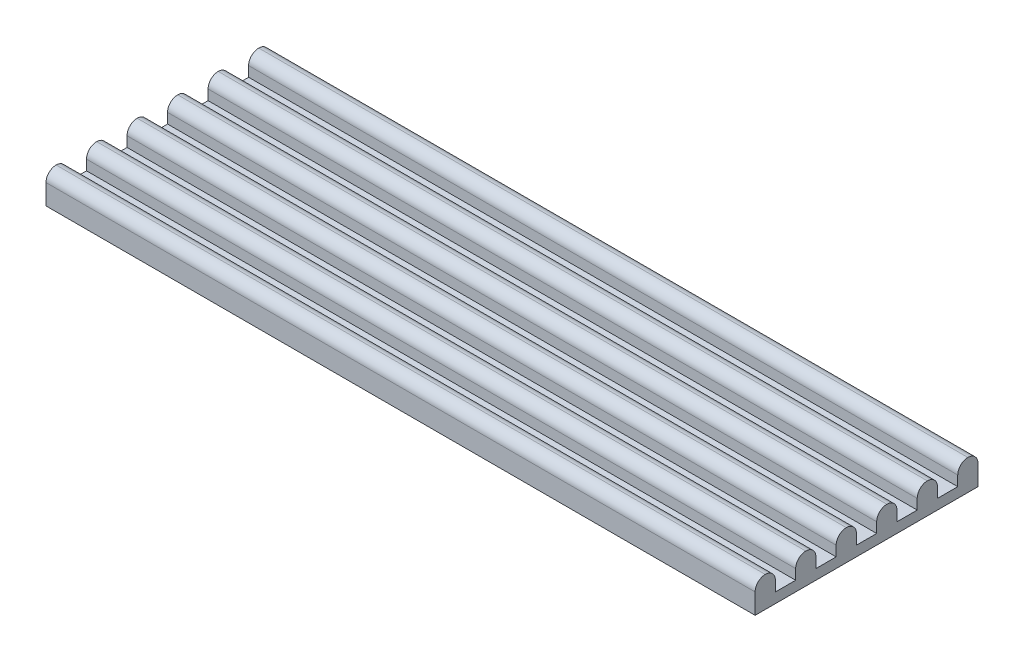
ISO-10303-21;
HEADER;
FILE_DESCRIPTION(('STEP AP214'),'2;1');
FILE_NAME('part.step','',(''),(''),'','','');
FILE_SCHEMA(('AUTOMOTIVE_DESIGN { 1 0 10303 214 1 1 1 1 }'));
ENDSEC;
DATA;
#1=APPLICATION_CONTEXT('core data for automotive mechanical design processes');
#2=APPLICATION_PROTOCOL_DEFINITION('international standard','automotive_design',2000,#1);
#3=PRODUCT_CONTEXT('',#1,'mechanical');
#4=PRODUCT('Part','Part','',(#3));
#5=PRODUCT_RELATED_PRODUCT_CATEGORY('part','',(#4));
#6=PRODUCT_DEFINITION_FORMATION('','',#4);
#7=PRODUCT_DEFINITION_CONTEXT('part definition',#1,'design');
#8=PRODUCT_DEFINITION('design','',#6,#7);
#9=PRODUCT_DEFINITION_SHAPE('','',#8);
#10=(LENGTH_UNIT() NAMED_UNIT(*) SI_UNIT(.MILLI.,.METRE.));
#11=(NAMED_UNIT(*) PLANE_ANGLE_UNIT() SI_UNIT($,.RADIAN.));
#12=(NAMED_UNIT(*) SI_UNIT($,.STERADIAN.) SOLID_ANGLE_UNIT());
#13=UNCERTAINTY_MEASURE_WITH_UNIT(LENGTH_MEASURE(1.E-05),#10,'distance_accuracy_value','');
#14=(GEOMETRIC_REPRESENTATION_CONTEXT(3) GLOBAL_UNCERTAINTY_ASSIGNED_CONTEXT((#13)) GLOBAL_UNIT_ASSIGNED_CONTEXT((#10,
#11,#12)) REPRESENTATION_CONTEXT('',''));
#15=CARTESIAN_POINT('',(0.,0.,0.));
#16=DIRECTION('',(0.,0.,1.));
#17=DIRECTION('',(1.,0.,0.));
#18=AXIS2_PLACEMENT_3D('',#15,#16,#17);
#19=CARTESIAN_POINT('',(35.,3.,-11.));
#20=DIRECTION('',(-1.,0.,0.));
#21=DIRECTION('',(0.,0.,1.));
#22=AXIS2_PLACEMENT_3D('',#19,#20,#21);
#23=PLANE('',#22);
#24=CARTESIAN_POINT('',(35.,2.,10.));
#25=DIRECTION('',(-1.,0.,0.));
#26=DIRECTION('',(0.,0.,1.));
#27=AXIS2_PLACEMENT_3D('',#24,#25,#26);
#28=CIRCLE('',#27,1.);
#29=CARTESIAN_POINT('',(35.,2.,9.));
#30=VERTEX_POINT('',#29);
#31=CARTESIAN_POINT('',(35.,3.,10.));
#32=VERTEX_POINT('',#31);
#33=EDGE_CURVE('E466',#30,#32,#28,.F.);
#34=ORIENTED_EDGE('',*,*,#33,.T.);
#35=CARTESIAN_POINT('',(35.,2.,10.));
#36=DIRECTION('',(-1.,0.,0.));
#37=DIRECTION('',(0.,0.,1.));
#38=AXIS2_PLACEMENT_3D('',#35,#36,#37);
#39=CIRCLE('',#38,1.);
#40=CARTESIAN_POINT('',(35.,2.,11.));
#41=VERTEX_POINT('',#40);
#42=EDGE_CURVE('E469',#32,#41,#39,.F.);
#43=ORIENTED_EDGE('',*,*,#42,.T.);
#44=DIRECTION('',(0.,-1.,0.));
#45=VECTOR('',#44,1.);
#46=CARTESIAN_POINT('',(35.,3.,11.));
#47=LINE('',#46,#45);
#48=CARTESIAN_POINT('',(35.,0.,11.));
#49=VERTEX_POINT('',#48);
#50=EDGE_CURVE('E424',#41,#49,#47,.T.);
#51=ORIENTED_EDGE('',*,*,#50,.T.);
#52=DIRECTION('',(0.,0.,-1.));
#53=VECTOR('',#52,1.);
#54=CARTESIAN_POINT('',(35.,0.,-11.));
#55=LINE('',#54,#53);
#56=CARTESIAN_POINT('',(35.,0.,-11.));
#57=VERTEX_POINT('',#56);
#58=EDGE_CURVE('E278',#49,#57,#55,.T.);
#59=ORIENTED_EDGE('',*,*,#58,.T.);
#60=DIRECTION('',(0.,-1.,0.));
#61=VECTOR('',#60,1.);
#62=CARTESIAN_POINT('',(35.,3.,-11.));
#63=LINE('',#62,#61);
#64=CARTESIAN_POINT('',(35.,2.,-11.));
#65=VERTEX_POINT('',#64);
#66=EDGE_CURVE('E433',#65,#57,#63,.T.);
#67=ORIENTED_EDGE('',*,*,#66,.F.);
#68=CARTESIAN_POINT('',(35.,2.,-9.99999999999999));
#69=DIRECTION('',(-1.,0.,0.));
#70=DIRECTION('',(0.,0.,1.));
#71=AXIS2_PLACEMENT_3D('',#68,#69,#70);
#72=CIRCLE('',#71,1.);
#73=CARTESIAN_POINT('',(35.,3.,-9.99999999999999));
#74=VERTEX_POINT('',#73);
#75=EDGE_CURVE('E436',#65,#74,#72,.F.);
#76=ORIENTED_EDGE('',*,*,#75,.T.);
#77=CARTESIAN_POINT('',(35.,2.,-10.));
#78=DIRECTION('',(-1.,0.,0.));
#79=DIRECTION('',(0.,0.,1.));
#80=AXIS2_PLACEMENT_3D('',#77,#78,#79);
#81=CIRCLE('',#80,1.);
#82=CARTESIAN_POINT('',(35.,2.,-9.));
#83=VERTEX_POINT('',#82);
#84=EDGE_CURVE('E439',#74,#83,#81,.F.);
#85=ORIENTED_EDGE('',*,*,#84,.T.);
#86=DIRECTION('',(0.,1.,0.));
#87=VECTOR('',#86,1.);
#88=CARTESIAN_POINT('',(35.,1.,-9.));
#89=LINE('',#88,#87);
#90=CARTESIAN_POINT('',(35.,1.,-9.));
#91=VERTEX_POINT('',#90);
#92=EDGE_CURVE('E352',#91,#83,#89,.T.);
#93=ORIENTED_EDGE('',*,*,#92,.F.);
#94=DIRECTION('',(0.,0.,-1.));
#95=VECTOR('',#94,1.);
#96=CARTESIAN_POINT('',(35.,1.,0.));
#97=LINE('',#96,#95);
#98=CARTESIAN_POINT('',(35.,1.,-7.));
#99=VERTEX_POINT('',#98);
#100=EDGE_CURVE('E390',#99,#91,#97,.T.);
#101=ORIENTED_EDGE('',*,*,#100,.F.);
#102=DIRECTION('',(0.,1.,0.));
#103=VECTOR('',#102,1.);
#104=CARTESIAN_POINT('',(35.,1.,-7.));
#105=LINE('',#104,#103);
#106=CARTESIAN_POINT('',(35.,2.,-7.));
#107=VERTEX_POINT('',#106);
#108=EDGE_CURVE('E398',#99,#107,#105,.T.);
#109=ORIENTED_EDGE('',*,*,#108,.T.);
#110=CARTESIAN_POINT('',(35.,2.,-6.));
#111=DIRECTION('',(-1.,0.,0.));
#112=DIRECTION('',(0.,0.,1.));
#113=AXIS2_PLACEMENT_3D('',#110,#111,#112);
#114=CIRCLE('',#113,1.);
#115=CARTESIAN_POINT('',(35.,3.,-6.));
#116=VERTEX_POINT('',#115);
#117=EDGE_CURVE('E442',#107,#116,#114,.F.);
#118=ORIENTED_EDGE('',*,*,#117,.T.);
#119=CARTESIAN_POINT('',(35.,2.,-6.));
#120=DIRECTION('',(-1.,0.,0.));
#121=DIRECTION('',(0.,0.,1.));
#122=AXIS2_PLACEMENT_3D('',#119,#120,#121);
#123=CIRCLE('',#122,1.);
#124=CARTESIAN_POINT('',(35.,2.,-5.));
#125=VERTEX_POINT('',#124);
#126=EDGE_CURVE('E445',#116,#125,#123,.F.);
#127=ORIENTED_EDGE('',*,*,#126,.T.);
#128=DIRECTION('',(0.,1.,0.));
#129=VECTOR('',#128,1.);
#130=CARTESIAN_POINT('',(35.,1.,-5.));
#131=LINE('',#130,#129);
#132=CARTESIAN_POINT('',(35.,1.,-5.));
#133=VERTEX_POINT('',#132);
#134=EDGE_CURVE('E371',#133,#125,#131,.T.);
#135=ORIENTED_EDGE('',*,*,#134,.F.);
#136=DIRECTION('',(0.,0.,-1.));
#137=VECTOR('',#136,1.);
#138=CARTESIAN_POINT('',(35.,1.,0.));
#139=LINE('',#138,#137);
#140=CARTESIAN_POINT('',(35.,1.,-3.));
#141=VERTEX_POINT('',#140);
#142=EDGE_CURVE('E351',#141,#133,#139,.T.);
#143=ORIENTED_EDGE('',*,*,#142,.F.);
#144=DIRECTION('',(0.,1.,0.));
#145=VECTOR('',#144,1.);
#146=CARTESIAN_POINT('',(35.,1.,-3.));
#147=LINE('',#146,#145);
#148=CARTESIAN_POINT('',(35.,2.,-3.));
#149=VERTEX_POINT('',#148);
#150=EDGE_CURVE('E363',#141,#149,#147,.T.);
#151=ORIENTED_EDGE('',*,*,#150,.T.);
#152=CARTESIAN_POINT('',(35.,2.,-2.));
#153=DIRECTION('',(-1.,0.,0.));
#154=DIRECTION('',(0.,0.,1.));
#155=AXIS2_PLACEMENT_3D('',#152,#153,#154);
#156=CIRCLE('',#155,1.);
#157=CARTESIAN_POINT('',(35.,3.,-2.));
#158=VERTEX_POINT('',#157);
#159=EDGE_CURVE('E448',#149,#158,#156,.F.);
#160=ORIENTED_EDGE('',*,*,#159,.T.);
#161=CARTESIAN_POINT('',(35.,2.,-2.));
#162=DIRECTION('',(-1.,0.,0.));
#163=DIRECTION('',(0.,0.,1.));
#164=AXIS2_PLACEMENT_3D('',#161,#162,#163);
#165=CIRCLE('',#164,1.);
#166=CARTESIAN_POINT('',(35.,2.,-0.999999999999997));
#167=VERTEX_POINT('',#166);
#168=EDGE_CURVE('E451',#158,#167,#165,.F.);
#169=ORIENTED_EDGE('',*,*,#168,.T.);
#170=DIRECTION('',(0.,1.,0.));
#171=VECTOR('',#170,1.);
#172=CARTESIAN_POINT('',(35.,1.,-0.999999999999997));
#173=LINE('',#172,#171);
#174=CARTESIAN_POINT('',(35.,1.,-0.999999999999997));
#175=VERTEX_POINT('',#174);
#176=EDGE_CURVE('E290',#175,#167,#173,.T.);
#177=ORIENTED_EDGE('',*,*,#176,.F.);
#178=DIRECTION('',(0.,0.,-1.));
#179=VECTOR('',#178,1.);
#180=CARTESIAN_POINT('',(35.,1.,0.));
#181=LINE('',#180,#179);
#182=CARTESIAN_POINT('',(35.,1.,1.));
#183=VERTEX_POINT('',#182);
#184=EDGE_CURVE('E328',#183,#175,#181,.T.);
#185=ORIENTED_EDGE('',*,*,#184,.F.);
#186=DIRECTION('',(0.,1.,0.));
#187=VECTOR('',#186,1.);
#188=CARTESIAN_POINT('',(35.,1.,1.));
#189=LINE('',#188,#187);
#190=CARTESIAN_POINT('',(35.,2.,1.));
#191=VERTEX_POINT('',#190);
#192=EDGE_CURVE('E336',#183,#191,#189,.T.);
#193=ORIENTED_EDGE('',*,*,#192,.T.);
#194=CARTESIAN_POINT('',(35.,2.,2.));
#195=DIRECTION('',(-1.,0.,0.));
#196=DIRECTION('',(0.,0.,1.));
#197=AXIS2_PLACEMENT_3D('',#194,#195,#196);
#198=CIRCLE('',#197,1.);
#199=CARTESIAN_POINT('',(35.,3.,2.));
#200=VERTEX_POINT('',#199);
#201=EDGE_CURVE('E454',#191,#200,#198,.F.);
#202=ORIENTED_EDGE('',*,*,#201,.T.);
#203=CARTESIAN_POINT('',(35.,2.,2.));
#204=DIRECTION('',(-1.,0.,0.));
#205=DIRECTION('',(0.,0.,1.));
#206=AXIS2_PLACEMENT_3D('',#203,#204,#205);
#207=CIRCLE('',#206,1.);
#208=CARTESIAN_POINT('',(35.,2.,3.));
#209=VERTEX_POINT('',#208);
#210=EDGE_CURVE('E457',#200,#209,#207,.F.);
#211=ORIENTED_EDGE('',*,*,#210,.T.);
#212=DIRECTION('',(0.,1.,0.));
#213=VECTOR('',#212,1.);
#214=CARTESIAN_POINT('',(35.,1.,3.));
#215=LINE('',#214,#213);
#216=CARTESIAN_POINT('',(35.,1.,3.));
#217=VERTEX_POINT('',#216);
#218=EDGE_CURVE('E309',#217,#209,#215,.T.);
#219=ORIENTED_EDGE('',*,*,#218,.F.);
#220=DIRECTION('',(0.,0.,-1.));
#221=VECTOR('',#220,1.);
#222=CARTESIAN_POINT('',(35.,1.,0.));
#223=LINE('',#222,#221);
#224=CARTESIAN_POINT('',(35.,1.,5.));
#225=VERTEX_POINT('',#224);
#226=EDGE_CURVE('E289',#225,#217,#223,.T.);
#227=ORIENTED_EDGE('',*,*,#226,.F.);
#228=DIRECTION('',(0.,1.,0.));
#229=VECTOR('',#228,1.);
#230=CARTESIAN_POINT('',(35.,1.,5.));
#231=LINE('',#230,#229);
#232=CARTESIAN_POINT('',(35.,2.,5.));
#233=VERTEX_POINT('',#232);
#234=EDGE_CURVE('E301',#225,#233,#231,.T.);
#235=ORIENTED_EDGE('',*,*,#234,.T.);
#236=CARTESIAN_POINT('',(35.,2.,6.));
#237=DIRECTION('',(-1.,0.,0.));
#238=DIRECTION('',(0.,0.,1.));
#239=AXIS2_PLACEMENT_3D('',#236,#237,#238);
#240=CIRCLE('',#239,1.);
#241=CARTESIAN_POINT('',(35.,3.,6.));
#242=VERTEX_POINT('',#241);
#243=EDGE_CURVE('E460',#233,#242,#240,.F.);
#244=ORIENTED_EDGE('',*,*,#243,.T.);
#245=CARTESIAN_POINT('',(35.,2.,6.));
#246=DIRECTION('',(-1.,0.,0.));
#247=DIRECTION('',(0.,0.,1.));
#248=AXIS2_PLACEMENT_3D('',#245,#246,#247);
#249=CIRCLE('',#248,1.);
#250=CARTESIAN_POINT('',(35.,2.,7.));
#251=VERTEX_POINT('',#250);
#252=EDGE_CURVE('E463',#242,#251,#249,.F.);
#253=ORIENTED_EDGE('',*,*,#252,.T.);
#254=DIRECTION('',(0.,1.,0.));
#255=VECTOR('',#254,1.);
#256=CARTESIAN_POINT('',(35.,1.,7.));
#257=LINE('',#256,#255);
#258=CARTESIAN_POINT('',(35.,1.,7.));
#259=VERTEX_POINT('',#258);
#260=EDGE_CURVE('E275',#259,#251,#257,.T.);
#261=ORIENTED_EDGE('',*,*,#260,.F.);
#262=DIRECTION('',(0.,0.,-1.));
#263=VECTOR('',#262,1.);
#264=CARTESIAN_POINT('',(35.,1.,0.));
#265=LINE('',#264,#263);
#266=CARTESIAN_POINT('',(35.,1.,9.));
#267=VERTEX_POINT('',#266);
#268=EDGE_CURVE('E254',#267,#259,#265,.T.);
#269=ORIENTED_EDGE('',*,*,#268,.F.);
#270=DIRECTION('',(0.,1.,0.));
#271=VECTOR('',#270,1.);
#272=CARTESIAN_POINT('',(35.,1.,9.));
#273=LINE('',#272,#271);
#274=EDGE_CURVE('E279',#267,#30,#273,.T.);
#275=ORIENTED_EDGE('',*,*,#274,.T.);
#276=EDGE_LOOP('',(#34,#43,#51,#59,#67,#76,#85,#93,#101,#109,#118,#127,#135,#143,#151,#160,#169,
#177,#185,#193,#202,#211,#219,#227,#235,#244,#253,#261,#269,#275));
#277=FACE_BOUND('',#276,.T.);
#278=ADVANCED_FACE('F45',(#277),#23,.F.);
#279=CARTESIAN_POINT('',(-35.,3.,-11.));
#280=DIRECTION('',(1.,0.,0.));
#281=DIRECTION('',(0.,0.,-1.));
#282=AXIS2_PLACEMENT_3D('',#279,#280,#281);
#283=PLANE('',#282);
#284=DIRECTION('',(0.,-1.,0.));
#285=VECTOR('',#284,1.);
#286=CARTESIAN_POINT('',(-35.,3.,11.));
#287=LINE('',#286,#285);
#288=CARTESIAN_POINT('',(-35.,2.,11.));
#289=VERTEX_POINT('',#288);
#290=CARTESIAN_POINT('',(-35.,0.,11.));
#291=VERTEX_POINT('',#290);
#292=EDGE_CURVE('E427',#289,#291,#287,.T.);
#293=ORIENTED_EDGE('',*,*,#292,.F.);
#294=CARTESIAN_POINT('',(-35.,2.,10.));
#295=DIRECTION('',(1.,0.,0.));
#296=DIRECTION('',(0.,0.,-1.));
#297=AXIS2_PLACEMENT_3D('',#294,#295,#296);
#298=CIRCLE('',#297,1.);
#299=CARTESIAN_POINT('',(-35.,3.,10.));
#300=VERTEX_POINT('',#299);
#301=EDGE_CURVE('E68',#289,#300,#298,.F.);
#302=ORIENTED_EDGE('',*,*,#301,.T.);
#303=CARTESIAN_POINT('',(-35.,2.,10.));
#304=DIRECTION('',(1.,0.,0.));
#305=DIRECTION('',(0.,0.,-1.));
#306=AXIS2_PLACEMENT_3D('',#303,#304,#305);
#307=CIRCLE('',#306,1.);
#308=CARTESIAN_POINT('',(-35.,2.,9.));
#309=VERTEX_POINT('',#308);
#310=EDGE_CURVE('E63',#300,#309,#307,.F.);
#311=ORIENTED_EDGE('',*,*,#310,.T.);
#312=DIRECTION('',(0.,1.,0.));
#313=VECTOR('',#312,1.);
#314=CARTESIAN_POINT('',(-35.,1.,9.));
#315=LINE('',#314,#313);
#316=CARTESIAN_POINT('',(-35.,1.,9.));
#317=VERTEX_POINT('',#316);
#318=EDGE_CURVE('E253',#317,#309,#315,.T.);
#319=ORIENTED_EDGE('',*,*,#318,.F.);
#320=DIRECTION('',(0.,0.,1.));
#321=VECTOR('',#320,1.);
#322=CARTESIAN_POINT('',(-35.,1.,0.));
#323=LINE('',#322,#321);
#324=CARTESIAN_POINT('',(-35.,1.,7.));
#325=VERTEX_POINT('',#324);
#326=EDGE_CURVE('E260',#325,#317,#323,.T.);
#327=ORIENTED_EDGE('',*,*,#326,.F.);
#328=DIRECTION('',(0.,1.,0.));
#329=VECTOR('',#328,1.);
#330=CARTESIAN_POINT('',(-35.,1.,7.));
#331=LINE('',#330,#329);
#332=CARTESIAN_POINT('',(-35.,2.,7.));
#333=VERTEX_POINT('',#332);
#334=EDGE_CURVE('E243',#325,#333,#331,.T.);
#335=ORIENTED_EDGE('',*,*,#334,.T.);
#336=CARTESIAN_POINT('',(-35.,2.,6.));
#337=DIRECTION('',(1.,0.,0.));
#338=DIRECTION('',(0.,0.,-1.));
#339=AXIS2_PLACEMENT_3D('',#336,#337,#338);
#340=CIRCLE('',#339,1.);
#341=CARTESIAN_POINT('',(-35.,3.,6.));
#342=VERTEX_POINT('',#341);
#343=EDGE_CURVE('E503',#333,#342,#340,.F.);
#344=ORIENTED_EDGE('',*,*,#343,.T.);
#345=CARTESIAN_POINT('',(-35.,2.,6.));
#346=DIRECTION('',(1.,0.,0.));
#347=DIRECTION('',(0.,0.,-1.));
#348=AXIS2_PLACEMENT_3D('',#345,#346,#347);
#349=CIRCLE('',#348,1.);
#350=CARTESIAN_POINT('',(-35.,2.,5.));
#351=VERTEX_POINT('',#350);
#352=EDGE_CURVE('E500',#342,#351,#349,.F.);
#353=ORIENTED_EDGE('',*,*,#352,.T.);
#354=DIRECTION('',(0.,1.,0.));
#355=VECTOR('',#354,1.);
#356=CARTESIAN_POINT('',(-35.,1.,5.));
#357=LINE('',#356,#355);
#358=CARTESIAN_POINT('',(-35.,1.,5.));
#359=VERTEX_POINT('',#358);
#360=EDGE_CURVE('E264',#359,#351,#357,.T.);
#361=ORIENTED_EDGE('',*,*,#360,.F.);
#362=DIRECTION('',(0.,0.,1.));
#363=VECTOR('',#362,1.);
#364=CARTESIAN_POINT('',(-35.,1.,0.));
#365=LINE('',#364,#363);
#366=CARTESIAN_POINT('',(-35.,1.,3.));
#367=VERTEX_POINT('',#366);
#368=EDGE_CURVE('E297',#367,#359,#365,.T.);
#369=ORIENTED_EDGE('',*,*,#368,.F.);
#370=DIRECTION('',(0.,1.,0.));
#371=VECTOR('',#370,1.);
#372=CARTESIAN_POINT('',(-35.,1.,3.));
#373=LINE('',#372,#371);
#374=CARTESIAN_POINT('',(-35.,2.,3.));
#375=VERTEX_POINT('',#374);
#376=EDGE_CURVE('E305',#367,#375,#373,.T.);
#377=ORIENTED_EDGE('',*,*,#376,.T.);
#378=CARTESIAN_POINT('',(-35.,2.,2.));
#379=DIRECTION('',(1.,0.,0.));
#380=DIRECTION('',(0.,0.,-1.));
#381=AXIS2_PLACEMENT_3D('',#378,#379,#380);
#382=CIRCLE('',#381,1.);
#383=CARTESIAN_POINT('',(-35.,3.,2.));
#384=VERTEX_POINT('',#383);
#385=EDGE_CURVE('E497',#375,#384,#382,.F.);
#386=ORIENTED_EDGE('',*,*,#385,.T.);
#387=CARTESIAN_POINT('',(-35.,2.,2.));
#388=DIRECTION('',(1.,0.,0.));
#389=DIRECTION('',(0.,0.,-1.));
#390=AXIS2_PLACEMENT_3D('',#387,#388,#389);
#391=CIRCLE('',#390,1.);
#392=CARTESIAN_POINT('',(-35.,2.,1.));
#393=VERTEX_POINT('',#392);
#394=EDGE_CURVE('E494',#384,#393,#391,.F.);
#395=ORIENTED_EDGE('',*,*,#394,.T.);
#396=DIRECTION('',(0.,1.,0.));
#397=VECTOR('',#396,1.);
#398=CARTESIAN_POINT('',(-35.,1.,1.));
#399=LINE('',#398,#397);
#400=CARTESIAN_POINT('',(-35.,1.,1.));
#401=VERTEX_POINT('',#400);
#402=EDGE_CURVE('E340',#401,#393,#399,.T.);
#403=ORIENTED_EDGE('',*,*,#402,.F.);
#404=DIRECTION('',(0.,0.,1.));
#405=VECTOR('',#404,1.);
#406=CARTESIAN_POINT('',(-35.,1.,0.));
#407=LINE('',#406,#405);
#408=CARTESIAN_POINT('',(-35.,1.,-0.999999999999997));
#409=VERTEX_POINT('',#408);
#410=EDGE_CURVE('E319',#409,#401,#407,.T.);
#411=ORIENTED_EDGE('',*,*,#410,.F.);
#412=DIRECTION('',(0.,1.,0.));
#413=VECTOR('',#412,1.);
#414=CARTESIAN_POINT('',(-35.,1.,-0.999999999999997));
#415=LINE('',#414,#413);
#416=CARTESIAN_POINT('',(-35.,2.,-0.999999999999997));
#417=VERTEX_POINT('',#416);
#418=EDGE_CURVE('E332',#409,#417,#415,.T.);
#419=ORIENTED_EDGE('',*,*,#418,.T.);
#420=CARTESIAN_POINT('',(-35.,2.,-2.));
#421=DIRECTION('',(1.,0.,0.));
#422=DIRECTION('',(0.,0.,-1.));
#423=AXIS2_PLACEMENT_3D('',#420,#421,#422);
#424=CIRCLE('',#423,1.);
#425=CARTESIAN_POINT('',(-35.,3.,-2.));
#426=VERTEX_POINT('',#425);
#427=EDGE_CURVE('E491',#417,#426,#424,.F.);
#428=ORIENTED_EDGE('',*,*,#427,.T.);
#429=CARTESIAN_POINT('',(-35.,2.,-2.));
#430=DIRECTION('',(1.,0.,0.));
#431=DIRECTION('',(0.,0.,-1.));
#432=AXIS2_PLACEMENT_3D('',#429,#430,#431);
#433=CIRCLE('',#432,1.);
#434=CARTESIAN_POINT('',(-35.,2.,-3.));
#435=VERTEX_POINT('',#434);
#436=EDGE_CURVE('E488',#426,#435,#433,.F.);
#437=ORIENTED_EDGE('',*,*,#436,.T.);
#438=DIRECTION('',(0.,1.,0.));
#439=VECTOR('',#438,1.);
#440=CARTESIAN_POINT('',(-35.,1.,-3.));
#441=LINE('',#440,#439);
#442=CARTESIAN_POINT('',(-35.,1.,-3.));
#443=VERTEX_POINT('',#442);
#444=EDGE_CURVE('E320',#443,#435,#441,.T.);
#445=ORIENTED_EDGE('',*,*,#444,.F.);
#446=DIRECTION('',(0.,0.,1.));
#447=VECTOR('',#446,1.);
#448=CARTESIAN_POINT('',(-35.,1.,0.));
#449=LINE('',#448,#447);
#450=CARTESIAN_POINT('',(-35.,1.,-5.));
#451=VERTEX_POINT('',#450);
#452=EDGE_CURVE('E359',#451,#443,#449,.T.);
#453=ORIENTED_EDGE('',*,*,#452,.F.);
#454=DIRECTION('',(0.,1.,0.));
#455=VECTOR('',#454,1.);
#456=CARTESIAN_POINT('',(-35.,1.,-5.));
#457=LINE('',#456,#455);
#458=CARTESIAN_POINT('',(-35.,2.,-5.));
#459=VERTEX_POINT('',#458);
#460=EDGE_CURVE('E367',#451,#459,#457,.T.);
#461=ORIENTED_EDGE('',*,*,#460,.T.);
#462=CARTESIAN_POINT('',(-35.,2.,-6.));
#463=DIRECTION('',(1.,0.,0.));
#464=DIRECTION('',(0.,0.,-1.));
#465=AXIS2_PLACEMENT_3D('',#462,#463,#464);
#466=CIRCLE('',#465,1.);
#467=CARTESIAN_POINT('',(-35.,3.,-6.));
#468=VERTEX_POINT('',#467);
#469=EDGE_CURVE('E485',#459,#468,#466,.F.);
#470=ORIENTED_EDGE('',*,*,#469,.T.);
#471=CARTESIAN_POINT('',(-35.,2.,-6.));
#472=DIRECTION('',(1.,0.,0.));
#473=DIRECTION('',(0.,0.,-1.));
#474=AXIS2_PLACEMENT_3D('',#471,#472,#473);
#475=CIRCLE('',#474,1.);
#476=CARTESIAN_POINT('',(-35.,2.,-7.));
#477=VERTEX_POINT('',#476);
#478=EDGE_CURVE('E482',#468,#477,#475,.F.);
#479=ORIENTED_EDGE('',*,*,#478,.T.);
#480=DIRECTION('',(0.,1.,0.));
#481=VECTOR('',#480,1.);
#482=CARTESIAN_POINT('',(-35.,1.,-7.));
#483=LINE('',#482,#481);
#484=CARTESIAN_POINT('',(-35.,1.,-7.));
#485=VERTEX_POINT('',#484);
#486=EDGE_CURVE('E402',#485,#477,#483,.T.);
#487=ORIENTED_EDGE('',*,*,#486,.F.);
#488=DIRECTION('',(0.,0.,1.));
#489=VECTOR('',#488,1.);
#490=CARTESIAN_POINT('',(-35.,1.,0.));
#491=LINE('',#490,#489);
#492=CARTESIAN_POINT('',(-35.,1.,-9.));
#493=VERTEX_POINT('',#492);
#494=EDGE_CURVE('E381',#493,#485,#491,.T.);
#495=ORIENTED_EDGE('',*,*,#494,.F.);
#496=DIRECTION('',(0.,1.,0.));
#497=VECTOR('',#496,1.);
#498=CARTESIAN_POINT('',(-35.,1.,-9.));
#499=LINE('',#498,#497);
#500=CARTESIAN_POINT('',(-35.,2.,-9.));
#501=VERTEX_POINT('',#500);
#502=EDGE_CURVE('E394',#493,#501,#499,.T.);
#503=ORIENTED_EDGE('',*,*,#502,.T.);
#504=CARTESIAN_POINT('',(-35.,2.,-10.));
#505=DIRECTION('',(1.,0.,0.));
#506=DIRECTION('',(0.,0.,-1.));
#507=AXIS2_PLACEMENT_3D('',#504,#505,#506);
#508=CIRCLE('',#507,1.);
#509=CARTESIAN_POINT('',(-35.,3.,-9.99999999999999));
#510=VERTEX_POINT('',#509);
#511=EDGE_CURVE('E479',#501,#510,#508,.F.);
#512=ORIENTED_EDGE('',*,*,#511,.T.);
#513=CARTESIAN_POINT('',(-35.,2.,-9.99999999999999));
#514=DIRECTION('',(1.,0.,0.));
#515=DIRECTION('',(0.,0.,-1.));
#516=AXIS2_PLACEMENT_3D('',#513,#514,#515);
#517=CIRCLE('',#516,1.);
#518=CARTESIAN_POINT('',(-35.,2.,-11.));
#519=VERTEX_POINT('',#518);
#520=EDGE_CURVE('E476',#510,#519,#517,.F.);
#521=ORIENTED_EDGE('',*,*,#520,.T.);
#522=DIRECTION('',(0.,-1.,0.));
#523=VECTOR('',#522,1.);
#524=CARTESIAN_POINT('',(-35.,3.,-11.));
#525=LINE('',#524,#523);
#526=CARTESIAN_POINT('',(-35.,0.,-11.));
#527=VERTEX_POINT('',#526);
#528=EDGE_CURVE('E430',#519,#527,#525,.T.);
#529=ORIENTED_EDGE('',*,*,#528,.T.);
#530=DIRECTION('',(0.,0.,1.));
#531=VECTOR('',#530,1.);
#532=CARTESIAN_POINT('',(-35.,0.,-11.));
#533=LINE('',#532,#531);
#534=EDGE_CURVE('E416',#527,#291,#533,.T.);
#535=ORIENTED_EDGE('',*,*,#534,.T.);
#536=EDGE_LOOP('',(#293,#302,#311,#319,#327,#335,#344,#353,#361,#369,#377,#386,#395,#403,#411,
#419,#428,#437,#445,#453,#461,#470,#479,#487,#495,#503,#512,#521,#529,#535));
#537=FACE_BOUND('',#536,.T.);
#538=ADVANCED_FACE('F266',(#537),#283,.F.);
#539=CARTESIAN_POINT('',(-35.,3.,-11.));
#540=DIRECTION('',(0.,0.,1.));
#541=DIRECTION('',(1.,0.,0.));
#542=AXIS2_PLACEMENT_3D('',#539,#540,#541);
#543=PLANE('',#542);
#544=ORIENTED_EDGE('',*,*,#528,.F.);
#545=DIRECTION('',(-1.,0.,0.));
#546=VECTOR('',#545,1.);
#547=CARTESIAN_POINT('',(35.,2.,-11.));
#548=LINE('',#547,#546);
#549=EDGE_CURVE('E11',#519,#65,#548,.F.);
#550=ORIENTED_EDGE('',*,*,#549,.T.);
#551=ORIENTED_EDGE('',*,*,#66,.T.);
#552=DIRECTION('',(-1.,0.,0.));
#553=VECTOR('',#552,1.);
#554=CARTESIAN_POINT('',(-35.,0.,-11.));
#555=LINE('',#554,#553);
#556=EDGE_CURVE('E412',#57,#527,#555,.T.);
#557=ORIENTED_EDGE('',*,*,#556,.T.);
#558=EDGE_LOOP('',(#544,#550,#551,#557));
#559=FACE_BOUND('',#558,.T.);
#560=ADVANCED_FACE('F575',(#559),#543,.F.);
#561=CARTESIAN_POINT('',(-35.,3.,11.));
#562=DIRECTION('',(0.,0.,-1.));
#563=DIRECTION('',(-1.,0.,0.));
#564=AXIS2_PLACEMENT_3D('',#561,#562,#563);
#565=PLANE('',#564);
#566=ORIENTED_EDGE('',*,*,#50,.F.);
#567=DIRECTION('',(1.,0.,0.));
#568=VECTOR('',#567,1.);
#569=CARTESIAN_POINT('',(-35.,2.,11.));
#570=LINE('',#569,#568);
#571=EDGE_CURVE('E472',#41,#289,#570,.F.);
#572=ORIENTED_EDGE('',*,*,#571,.T.);
#573=ORIENTED_EDGE('',*,*,#292,.T.);
#574=DIRECTION('',(1.,0.,0.));
#575=VECTOR('',#574,1.);
#576=CARTESIAN_POINT('',(-35.,0.,11.));
#577=LINE('',#576,#575);
#578=EDGE_CURVE('E420',#291,#49,#577,.T.);
#579=ORIENTED_EDGE('',*,*,#578,.T.);
#580=EDGE_LOOP('',(#566,#572,#573,#579));
#581=FACE_BOUND('',#580,.T.);
#582=ADVANCED_FACE('F585',(#581),#565,.F.);
#583=CARTESIAN_POINT('',(0.,0.,0.));
#584=DIRECTION('',(0.,1.,0.));
#585=DIRECTION('',(0.,0.,1.));
#586=AXIS2_PLACEMENT_3D('',#583,#584,#585);
#587=PLANE('',#586);
#588=ORIENTED_EDGE('',*,*,#58,.F.);
#589=ORIENTED_EDGE('',*,*,#578,.F.);
#590=ORIENTED_EDGE('',*,*,#534,.F.);
#591=ORIENTED_EDGE('',*,*,#556,.F.);
#592=EDGE_LOOP('',(#588,#589,#590,#591));
#593=FACE_BOUND('',#592,.T.);
#594=ADVANCED_FACE('F582',(#593),#587,.F.);
#595=CARTESIAN_POINT('',(0.,1.,-9.));
#596=DIRECTION('',(0.,0.,1.));
#597=DIRECTION('',(1.,0.,0.));
#598=AXIS2_PLACEMENT_3D('',#595,#596,#597);
#599=PLANE('',#598);
#600=ORIENTED_EDGE('',*,*,#92,.T.);
#601=DIRECTION('',(1.,0.,0.));
#602=VECTOR('',#601,1.);
#603=CARTESIAN_POINT('',(0.,2.,-9.));
#604=LINE('',#603,#602);
#605=EDGE_CURVE('E55',#83,#501,#604,.F.);
#606=ORIENTED_EDGE('',*,*,#605,.T.);
#607=ORIENTED_EDGE('',*,*,#502,.F.);
#608=DIRECTION('',(1.,0.,0.));
#609=VECTOR('',#608,1.);
#610=CARTESIAN_POINT('',(0.,1.,-9.));
#611=LINE('',#610,#609);
#612=EDGE_CURVE('E378',#493,#91,#611,.T.);
#613=ORIENTED_EDGE('',*,*,#612,.T.);
#614=EDGE_LOOP('',(#600,#606,#607,#613));
#615=FACE_BOUND('',#614,.T.);
#616=ADVANCED_FACE('F676',(#615),#599,.T.);
#617=CARTESIAN_POINT('',(0.,1.,-7.));
#618=DIRECTION('',(0.,0.,1.));
#619=DIRECTION('',(1.,0.,0.));
#620=AXIS2_PLACEMENT_3D('',#617,#618,#619);
#621=PLANE('',#620);
#622=ORIENTED_EDGE('',*,*,#486,.T.);
#623=DIRECTION('',(1.,0.,0.));
#624=VECTOR('',#623,1.);
#625=CARTESIAN_POINT('',(35.,2.,-7.));
#626=LINE('',#625,#624);
#627=EDGE_CURVE('E536',#477,#107,#626,.T.);
#628=ORIENTED_EDGE('',*,*,#627,.T.);
#629=ORIENTED_EDGE('',*,*,#108,.F.);
#630=DIRECTION('',(1.,0.,0.));
#631=VECTOR('',#630,1.);
#632=CARTESIAN_POINT('',(0.,1.,-7.));
#633=LINE('',#632,#631);
#634=EDGE_CURVE('E386',#485,#99,#633,.T.);
#635=ORIENTED_EDGE('',*,*,#634,.F.);
#636=EDGE_LOOP('',(#622,#628,#629,#635));
#637=FACE_BOUND('',#636,.T.);
#638=ADVANCED_FACE('F671',(#637),#621,.F.);
#639=CARTESIAN_POINT('',(0.,1.,0.));
#640=DIRECTION('',(0.,1.,0.));
#641=DIRECTION('',(0.,0.,1.));
#642=AXIS2_PLACEMENT_3D('',#639,#640,#641);
#643=PLANE('',#642);
#644=ORIENTED_EDGE('',*,*,#612,.F.);
#645=ORIENTED_EDGE('',*,*,#494,.T.);
#646=ORIENTED_EDGE('',*,*,#634,.T.);
#647=ORIENTED_EDGE('',*,*,#100,.T.);
#648=EDGE_LOOP('',(#644,#645,#646,#647));
#649=FACE_BOUND('',#648,.T.);
#650=ADVANCED_FACE('F674',(#649),#643,.T.);
#651=CARTESIAN_POINT('',(0.,1.,-3.));
#652=DIRECTION('',(0.,0.,1.));
#653=DIRECTION('',(1.,0.,0.));
#654=AXIS2_PLACEMENT_3D('',#651,#652,#653);
#655=PLANE('',#654);
#656=ORIENTED_EDGE('',*,*,#444,.T.);
#657=DIRECTION('',(1.,0.,0.));
#658=VECTOR('',#657,1.);
#659=CARTESIAN_POINT('',(35.,2.,-3.));
#660=LINE('',#659,#658);
#661=EDGE_CURVE('E529',#435,#149,#660,.T.);
#662=ORIENTED_EDGE('',*,*,#661,.T.);
#663=ORIENTED_EDGE('',*,*,#150,.F.);
#664=DIRECTION('',(1.,0.,0.));
#665=VECTOR('',#664,1.);
#666=CARTESIAN_POINT('',(0.,1.,-3.));
#667=LINE('',#666,#665);
#668=EDGE_CURVE('E347',#443,#141,#667,.T.);
#669=ORIENTED_EDGE('',*,*,#668,.F.);
#670=EDGE_LOOP('',(#656,#662,#663,#669));
#671=FACE_BOUND('',#670,.T.);
#672=ADVANCED_FACE('F652',(#671),#655,.F.);
#673=CARTESIAN_POINT('',(0.,1.,-5.));
#674=DIRECTION('',(0.,0.,1.));
#675=DIRECTION('',(1.,0.,0.));
#676=AXIS2_PLACEMENT_3D('',#673,#674,#675);
#677=PLANE('',#676);
#678=ORIENTED_EDGE('',*,*,#134,.T.);
#679=DIRECTION('',(1.,0.,0.));
#680=VECTOR('',#679,1.);
#681=CARTESIAN_POINT('',(0.,2.,-5.));
#682=LINE('',#681,#680);
#683=EDGE_CURVE('E532',#125,#459,#682,.F.);
#684=ORIENTED_EDGE('',*,*,#683,.T.);
#685=ORIENTED_EDGE('',*,*,#460,.F.);
#686=DIRECTION('',(1.,0.,0.));
#687=VECTOR('',#686,1.);
#688=CARTESIAN_POINT('',(0.,1.,-5.));
#689=LINE('',#688,#687);
#690=EDGE_CURVE('E356',#451,#133,#689,.T.);
#691=ORIENTED_EDGE('',*,*,#690,.T.);
#692=EDGE_LOOP('',(#678,#684,#685,#691));
#693=FACE_BOUND('',#692,.T.);
#694=ADVANCED_FACE('F659',(#693),#677,.T.);
#695=CARTESIAN_POINT('',(0.,1.,0.));
#696=DIRECTION('',(0.,1.,0.));
#697=DIRECTION('',(0.,0.,1.));
#698=AXIS2_PLACEMENT_3D('',#695,#696,#697);
#699=PLANE('',#698);
#700=ORIENTED_EDGE('',*,*,#668,.T.);
#701=ORIENTED_EDGE('',*,*,#142,.T.);
#702=ORIENTED_EDGE('',*,*,#690,.F.);
#703=ORIENTED_EDGE('',*,*,#452,.T.);
#704=EDGE_LOOP('',(#700,#701,#702,#703));
#705=FACE_BOUND('',#704,.T.);
#706=ADVANCED_FACE('F656',(#705),#699,.T.);
#707=CARTESIAN_POINT('',(0.,1.,-0.999999999999997));
#708=DIRECTION('',(0.,0.,1.));
#709=DIRECTION('',(1.,0.,0.));
#710=AXIS2_PLACEMENT_3D('',#707,#708,#709);
#711=PLANE('',#710);
#712=ORIENTED_EDGE('',*,*,#176,.T.);
#713=DIRECTION('',(1.,0.,0.));
#714=VECTOR('',#713,1.);
#715=CARTESIAN_POINT('',(0.,2.,-0.999999999999997));
#716=LINE('',#715,#714);
#717=EDGE_CURVE('E525',#167,#417,#716,.F.);
#718=ORIENTED_EDGE('',*,*,#717,.T.);
#719=ORIENTED_EDGE('',*,*,#418,.F.);
#720=DIRECTION('',(1.,0.,0.));
#721=VECTOR('',#720,1.);
#722=CARTESIAN_POINT('',(0.,1.,-0.999999999999997));
#723=LINE('',#722,#721);
#724=EDGE_CURVE('E316',#409,#175,#723,.T.);
#725=ORIENTED_EDGE('',*,*,#724,.T.);
#726=EDGE_LOOP('',(#712,#718,#719,#725));
#727=FACE_BOUND('',#726,.T.);
#728=ADVANCED_FACE('F638',(#727),#711,.T.);
#729=CARTESIAN_POINT('',(0.,1.,1.));
#730=DIRECTION('',(0.,0.,1.));
#731=DIRECTION('',(1.,0.,0.));
#732=AXIS2_PLACEMENT_3D('',#729,#730,#731);
#733=PLANE('',#732);
#734=ORIENTED_EDGE('',*,*,#402,.T.);
#735=DIRECTION('',(1.,0.,0.));
#736=VECTOR('',#735,1.);
#737=CARTESIAN_POINT('',(35.,2.,1.));
#738=LINE('',#737,#736);
#739=EDGE_CURVE('E522',#393,#191,#738,.T.);
#740=ORIENTED_EDGE('',*,*,#739,.T.);
#741=ORIENTED_EDGE('',*,*,#192,.F.);
#742=DIRECTION('',(1.,0.,0.));
#743=VECTOR('',#742,1.);
#744=CARTESIAN_POINT('',(0.,1.,1.));
#745=LINE('',#744,#743);
#746=EDGE_CURVE('E324',#401,#183,#745,.T.);
#747=ORIENTED_EDGE('',*,*,#746,.F.);
#748=EDGE_LOOP('',(#734,#740,#741,#747));
#749=FACE_BOUND('',#748,.T.);
#750=ADVANCED_FACE('F631',(#749),#733,.F.);
#751=CARTESIAN_POINT('',(0.,1.,0.));
#752=DIRECTION('',(0.,1.,0.));
#753=DIRECTION('',(0.,0.,1.));
#754=AXIS2_PLACEMENT_3D('',#751,#752,#753);
#755=PLANE('',#754);
#756=ORIENTED_EDGE('',*,*,#724,.F.);
#757=ORIENTED_EDGE('',*,*,#410,.T.);
#758=ORIENTED_EDGE('',*,*,#746,.T.);
#759=ORIENTED_EDGE('',*,*,#184,.T.);
#760=EDGE_LOOP('',(#756,#757,#758,#759));
#761=FACE_BOUND('',#760,.T.);
#762=ADVANCED_FACE('F635',(#761),#755,.T.);
#763=CARTESIAN_POINT('',(0.,1.,5.));
#764=DIRECTION('',(0.,0.,1.));
#765=DIRECTION('',(1.,0.,0.));
#766=AXIS2_PLACEMENT_3D('',#763,#764,#765);
#767=PLANE('',#766);
#768=ORIENTED_EDGE('',*,*,#360,.T.);
#769=DIRECTION('',(1.,0.,0.));
#770=VECTOR('',#769,1.);
#771=CARTESIAN_POINT('',(35.,2.,5.));
#772=LINE('',#771,#770);
#773=EDGE_CURVE('E515',#351,#233,#772,.T.);
#774=ORIENTED_EDGE('',*,*,#773,.T.);
#775=ORIENTED_EDGE('',*,*,#234,.F.);
#776=DIRECTION('',(1.,0.,0.));
#777=VECTOR('',#776,1.);
#778=CARTESIAN_POINT('',(0.,1.,5.));
#779=LINE('',#778,#777);
#780=EDGE_CURVE('E285',#359,#225,#779,.T.);
#781=ORIENTED_EDGE('',*,*,#780,.F.);
#782=EDGE_LOOP('',(#768,#774,#775,#781));
#783=FACE_BOUND('',#782,.T.);
#784=ADVANCED_FACE('F609',(#783),#767,.F.);
#785=CARTESIAN_POINT('',(0.,1.,3.));
#786=DIRECTION('',(0.,0.,1.));
#787=DIRECTION('',(1.,0.,0.));
#788=AXIS2_PLACEMENT_3D('',#785,#786,#787);
#789=PLANE('',#788);
#790=ORIENTED_EDGE('',*,*,#218,.T.);
#791=DIRECTION('',(1.,0.,0.));
#792=VECTOR('',#791,1.);
#793=CARTESIAN_POINT('',(0.,2.,3.));
#794=LINE('',#793,#792);
#795=EDGE_CURVE('E518',#209,#375,#794,.F.);
#796=ORIENTED_EDGE('',*,*,#795,.T.);
#797=ORIENTED_EDGE('',*,*,#376,.F.);
#798=DIRECTION('',(1.,0.,0.));
#799=VECTOR('',#798,1.);
#800=CARTESIAN_POINT('',(0.,1.,3.));
#801=LINE('',#800,#799);
#802=EDGE_CURVE('E294',#367,#217,#801,.T.);
#803=ORIENTED_EDGE('',*,*,#802,.T.);
#804=EDGE_LOOP('',(#790,#796,#797,#803));
#805=FACE_BOUND('',#804,.T.);
#806=ADVANCED_FACE('F618',(#805),#789,.T.);
#807=CARTESIAN_POINT('',(0.,1.,0.));
#808=DIRECTION('',(0.,1.,0.));
#809=DIRECTION('',(0.,0.,1.));
#810=AXIS2_PLACEMENT_3D('',#807,#808,#809);
#811=PLANE('',#810);
#812=ORIENTED_EDGE('',*,*,#780,.T.);
#813=ORIENTED_EDGE('',*,*,#226,.T.);
#814=ORIENTED_EDGE('',*,*,#802,.F.);
#815=ORIENTED_EDGE('',*,*,#368,.T.);
#816=EDGE_LOOP('',(#812,#813,#814,#815));
#817=FACE_BOUND('',#816,.T.);
#818=ADVANCED_FACE('F614',(#817),#811,.T.);
#819=CARTESIAN_POINT('',(0.,1.,7.));
#820=DIRECTION('',(0.,0.,1.));
#821=DIRECTION('',(1.,0.,0.));
#822=AXIS2_PLACEMENT_3D('',#819,#820,#821);
#823=PLANE('',#822);
#824=ORIENTED_EDGE('',*,*,#260,.T.);
#825=DIRECTION('',(1.,0.,0.));
#826=VECTOR('',#825,1.);
#827=CARTESIAN_POINT('',(0.,2.,7.));
#828=LINE('',#827,#826);
#829=EDGE_CURVE('E250',#251,#333,#828,.F.);
#830=ORIENTED_EDGE('',*,*,#829,.T.);
#831=ORIENTED_EDGE('',*,*,#334,.F.);
#832=DIRECTION('',(1.,0.,0.));
#833=VECTOR('',#832,1.);
#834=CARTESIAN_POINT('',(0.,1.,7.));
#835=LINE('',#834,#833);
#836=EDGE_CURVE('E247',#325,#259,#835,.T.);
#837=ORIENTED_EDGE('',*,*,#836,.T.);
#838=EDGE_LOOP('',(#824,#830,#831,#837));
#839=FACE_BOUND('',#838,.T.);
#840=ADVANCED_FACE('F246',(#839),#823,.T.);
#841=CARTESIAN_POINT('',(0.,1.,9.));
#842=DIRECTION('',(0.,0.,1.));
#843=DIRECTION('',(1.,0.,0.));
#844=AXIS2_PLACEMENT_3D('',#841,#842,#843);
#845=PLANE('',#844);
#846=ORIENTED_EDGE('',*,*,#318,.T.);
#847=DIRECTION('',(1.,0.,0.));
#848=VECTOR('',#847,1.);
#849=CARTESIAN_POINT('',(35.,2.,9.));
#850=LINE('',#849,#848);
#851=EDGE_CURVE('E510',#309,#30,#850,.T.);
#852=ORIENTED_EDGE('',*,*,#851,.T.);
#853=ORIENTED_EDGE('',*,*,#274,.F.);
#854=DIRECTION('',(1.,0.,0.));
#855=VECTOR('',#854,1.);
#856=CARTESIAN_POINT('',(0.,1.,9.));
#857=LINE('',#856,#855);
#858=EDGE_CURVE('E268',#317,#267,#857,.T.);
#859=ORIENTED_EDGE('',*,*,#858,.F.);
#860=EDGE_LOOP('',(#846,#852,#853,#859));
#861=FACE_BOUND('',#860,.T.);
#862=ADVANCED_FACE('F596',(#861),#845,.F.);
#863=CARTESIAN_POINT('',(0.,1.,0.));
#864=DIRECTION('',(0.,1.,0.));
#865=DIRECTION('',(0.,0.,1.));
#866=AXIS2_PLACEMENT_3D('',#863,#864,#865);
#867=PLANE('',#866);
#868=ORIENTED_EDGE('',*,*,#836,.F.);
#869=ORIENTED_EDGE('',*,*,#326,.T.);
#870=ORIENTED_EDGE('',*,*,#858,.T.);
#871=ORIENTED_EDGE('',*,*,#268,.T.);
#872=EDGE_LOOP('',(#868,#869,#870,#871));
#873=FACE_BOUND('',#872,.T.);
#874=ADVANCED_FACE('F258',(#873),#867,.T.);
#875=CARTESIAN_POINT('',(0.,2.,10.));
#876=DIRECTION('',(-1.,0.,0.));
#877=DIRECTION('',(0.,0.,1.));
#878=AXIS2_PLACEMENT_3D('',#875,#876,#877);
#879=CYLINDRICAL_SURFACE('',#878,1.);
#880=ORIENTED_EDGE('',*,*,#851,.F.);
#881=ORIENTED_EDGE('',*,*,#310,.F.);
#882=DIRECTION('',(1.,0.,0.));
#883=VECTOR('',#882,1.);
#884=CARTESIAN_POINT('',(-35.,3.,10.));
#885=LINE('',#884,#883);
#886=EDGE_CURVE('E382',#32,#300,#885,.F.);
#887=ORIENTED_EDGE('',*,*,#886,.F.);
#888=ORIENTED_EDGE('',*,*,#33,.F.);
#889=EDGE_LOOP('',(#880,#881,#887,#888));
#890=FACE_BOUND('',#889,.T.);
#891=ADVANCED_FACE('F594',(#890),#879,.T.);
#892=CARTESIAN_POINT('',(0.,2.,10.));
#893=DIRECTION('',(-1.,0.,0.));
#894=DIRECTION('',(0.,0.,1.));
#895=AXIS2_PLACEMENT_3D('',#892,#893,#894);
#896=CYLINDRICAL_SURFACE('',#895,1.);
#897=ORIENTED_EDGE('',*,*,#301,.F.);
#898=ORIENTED_EDGE('',*,*,#571,.F.);
#899=ORIENTED_EDGE('',*,*,#42,.F.);
#900=ORIENTED_EDGE('',*,*,#886,.T.);
#901=EDGE_LOOP('',(#897,#898,#899,#900));
#902=FACE_BOUND('',#901,.T.);
#903=ADVANCED_FACE('F589',(#902),#896,.T.);
#904=CARTESIAN_POINT('',(0.,2.,6.));
#905=DIRECTION('',(-1.,0.,0.));
#906=DIRECTION('',(0.,0.,1.));
#907=AXIS2_PLACEMENT_3D('',#904,#905,#906);
#908=CYLINDRICAL_SURFACE('',#907,1.);
#909=ORIENTED_EDGE('',*,*,#773,.F.);
#910=ORIENTED_EDGE('',*,*,#352,.F.);
#911=DIRECTION('',(1.,0.,0.));
#912=VECTOR('',#911,1.);
#913=CARTESIAN_POINT('',(-35.,3.,6.));
#914=LINE('',#913,#912);
#915=EDGE_CURVE('E545',#242,#342,#914,.F.);
#916=ORIENTED_EDGE('',*,*,#915,.F.);
#917=ORIENTED_EDGE('',*,*,#243,.F.);
#918=EDGE_LOOP('',(#909,#910,#916,#917));
#919=FACE_BOUND('',#918,.T.);
#920=ADVANCED_FACE('F606',(#919),#908,.T.);
#921=CARTESIAN_POINT('',(0.,2.,6.));
#922=DIRECTION('',(1.,0.,0.));
#923=DIRECTION('',(0.,0.,-1.));
#924=AXIS2_PLACEMENT_3D('',#921,#922,#923);
#925=CYLINDRICAL_SURFACE('',#924,1.);
#926=ORIENTED_EDGE('',*,*,#343,.F.);
#927=ORIENTED_EDGE('',*,*,#829,.F.);
#928=ORIENTED_EDGE('',*,*,#252,.F.);
#929=ORIENTED_EDGE('',*,*,#915,.T.);
#930=EDGE_LOOP('',(#926,#927,#928,#929));
#931=FACE_BOUND('',#930,.T.);
#932=ADVANCED_FACE('F600',(#931),#925,.T.);
#933=CARTESIAN_POINT('',(0.,2.,2.));
#934=DIRECTION('',(-1.,0.,0.));
#935=DIRECTION('',(0.,0.,1.));
#936=AXIS2_PLACEMENT_3D('',#933,#934,#935);
#937=CYLINDRICAL_SURFACE('',#936,1.);
#938=ORIENTED_EDGE('',*,*,#739,.F.);
#939=ORIENTED_EDGE('',*,*,#394,.F.);
#940=DIRECTION('',(1.,0.,0.));
#941=VECTOR('',#940,1.);
#942=CARTESIAN_POINT('',(-35.,3.,2.));
#943=LINE('',#942,#941);
#944=EDGE_CURVE('E549',#200,#384,#943,.F.);
#945=ORIENTED_EDGE('',*,*,#944,.F.);
#946=ORIENTED_EDGE('',*,*,#201,.F.);
#947=EDGE_LOOP('',(#938,#939,#945,#946));
#948=FACE_BOUND('',#947,.T.);
#949=ADVANCED_FACE('F627',(#948),#937,.T.);
#950=CARTESIAN_POINT('',(0.,2.,2.));
#951=DIRECTION('',(1.,0.,0.));
#952=DIRECTION('',(0.,0.,-1.));
#953=AXIS2_PLACEMENT_3D('',#950,#951,#952);
#954=CYLINDRICAL_SURFACE('',#953,1.);
#955=ORIENTED_EDGE('',*,*,#385,.F.);
#956=ORIENTED_EDGE('',*,*,#795,.F.);
#957=ORIENTED_EDGE('',*,*,#210,.F.);
#958=ORIENTED_EDGE('',*,*,#944,.T.);
#959=EDGE_LOOP('',(#955,#956,#957,#958));
#960=FACE_BOUND('',#959,.T.);
#961=ADVANCED_FACE('F622',(#960),#954,.T.);
#962=CARTESIAN_POINT('',(0.,2.,-2.));
#963=DIRECTION('',(-1.,0.,0.));
#964=DIRECTION('',(0.,0.,1.));
#965=AXIS2_PLACEMENT_3D('',#962,#963,#964);
#966=CYLINDRICAL_SURFACE('',#965,1.);
#967=ORIENTED_EDGE('',*,*,#661,.F.);
#968=ORIENTED_EDGE('',*,*,#436,.F.);
#969=DIRECTION('',(1.,0.,0.));
#970=VECTOR('',#969,1.);
#971=CARTESIAN_POINT('',(-35.,3.,-2.));
#972=LINE('',#971,#970);
#973=EDGE_CURVE('E553',#158,#426,#972,.F.);
#974=ORIENTED_EDGE('',*,*,#973,.F.);
#975=ORIENTED_EDGE('',*,*,#159,.F.);
#976=EDGE_LOOP('',(#967,#968,#974,#975));
#977=FACE_BOUND('',#976,.T.);
#978=ADVANCED_FACE('F648',(#977),#966,.T.);
#979=CARTESIAN_POINT('',(0.,2.,-2.));
#980=DIRECTION('',(1.,0.,0.));
#981=DIRECTION('',(0.,0.,-1.));
#982=AXIS2_PLACEMENT_3D('',#979,#980,#981);
#983=CYLINDRICAL_SURFACE('',#982,1.);
#984=ORIENTED_EDGE('',*,*,#427,.F.);
#985=ORIENTED_EDGE('',*,*,#717,.F.);
#986=ORIENTED_EDGE('',*,*,#168,.F.);
#987=ORIENTED_EDGE('',*,*,#973,.T.);
#988=EDGE_LOOP('',(#984,#985,#986,#987));
#989=FACE_BOUND('',#988,.T.);
#990=ADVANCED_FACE('F643',(#989),#983,.T.);
#991=CARTESIAN_POINT('',(0.,2.,-6.));
#992=DIRECTION('',(-1.,0.,0.));
#993=DIRECTION('',(0.,0.,1.));
#994=AXIS2_PLACEMENT_3D('',#991,#992,#993);
#995=CYLINDRICAL_SURFACE('',#994,1.);
#996=ORIENTED_EDGE('',*,*,#627,.F.);
#997=ORIENTED_EDGE('',*,*,#478,.F.);
#998=DIRECTION('',(1.,0.,0.));
#999=VECTOR('',#998,1.);
#1000=CARTESIAN_POINT('',(-35.,3.,-6.));
#1001=LINE('',#1000,#999);
#1002=EDGE_CURVE('E556',#116,#468,#1001,.F.);
#1003=ORIENTED_EDGE('',*,*,#1002,.F.);
#1004=ORIENTED_EDGE('',*,*,#117,.F.);
#1005=EDGE_LOOP('',(#996,#997,#1003,#1004));
#1006=FACE_BOUND('',#1005,.T.);
#1007=ADVANCED_FACE('F667',(#1006),#995,.T.);
#1008=CARTESIAN_POINT('',(0.,2.,-6.));
#1009=DIRECTION('',(1.,0.,0.));
#1010=DIRECTION('',(0.,0.,-1.));
#1011=AXIS2_PLACEMENT_3D('',#1008,#1009,#1010);
#1012=CYLINDRICAL_SURFACE('',#1011,1.);
#1013=ORIENTED_EDGE('',*,*,#469,.F.);
#1014=ORIENTED_EDGE('',*,*,#683,.F.);
#1015=ORIENTED_EDGE('',*,*,#126,.F.);
#1016=ORIENTED_EDGE('',*,*,#1002,.T.);
#1017=EDGE_LOOP('',(#1013,#1014,#1015,#1016));
#1018=FACE_BOUND('',#1017,.T.);
#1019=ADVANCED_FACE('F662',(#1018),#1012,.T.);
#1020=CARTESIAN_POINT('',(0.,2.,-9.99999999999999));
#1021=DIRECTION('',(1.,0.,0.));
#1022=DIRECTION('',(0.,0.,-1.));
#1023=AXIS2_PLACEMENT_3D('',#1020,#1021,#1022);
#1024=CYLINDRICAL_SURFACE('',#1023,1.);
#1025=ORIENTED_EDGE('',*,*,#549,.F.);
#1026=ORIENTED_EDGE('',*,*,#520,.F.);
#1027=DIRECTION('',(-1.,0.,0.));
#1028=VECTOR('',#1027,1.);
#1029=CARTESIAN_POINT('',(-35.,3.,-9.99999999999999));
#1030=LINE('',#1029,#1028);
#1031=EDGE_CURVE('E49',#74,#510,#1030,.T.);
#1032=ORIENTED_EDGE('',*,*,#1031,.F.);
#1033=ORIENTED_EDGE('',*,*,#75,.F.);
#1034=EDGE_LOOP('',(#1025,#1026,#1032,#1033));
#1035=FACE_BOUND('',#1034,.T.);
#1036=ADVANCED_FACE('F47',(#1035),#1024,.T.);
#1037=CARTESIAN_POINT('',(0.,2.,-10.));
#1038=DIRECTION('',(1.,0.,0.));
#1039=DIRECTION('',(0.,0.,-1.));
#1040=AXIS2_PLACEMENT_3D('',#1037,#1038,#1039);
#1041=CYLINDRICAL_SURFACE('',#1040,1.);
#1042=ORIENTED_EDGE('',*,*,#511,.F.);
#1043=ORIENTED_EDGE('',*,*,#605,.F.);
#1044=ORIENTED_EDGE('',*,*,#84,.F.);
#1045=ORIENTED_EDGE('',*,*,#1031,.T.);
#1046=EDGE_LOOP('',(#1042,#1043,#1044,#1045));
#1047=FACE_BOUND('',#1046,.T.);
#1048=ADVANCED_FACE('F567',(#1047),#1041,.T.);
#1049=CLOSED_SHELL('',(#278,#538,#560,#582,#594,#616,#638,#650,#672,#694,#706,#728,#750,#762,
#784,#806,#818,#840,#862,#874,#891,#903,#920,#932,#949,#961,#978,#990,#1007,#1019,#1036,#1048));
#1050=MANIFOLD_SOLID_BREP('B2',#1049);
#1051=ADVANCED_BREP_SHAPE_REPRESENTATION('',(#18,#1050),#14);
#1052=SHAPE_DEFINITION_REPRESENTATION(#9,#1051);
ENDSEC;
END-ISO-10303-21;
